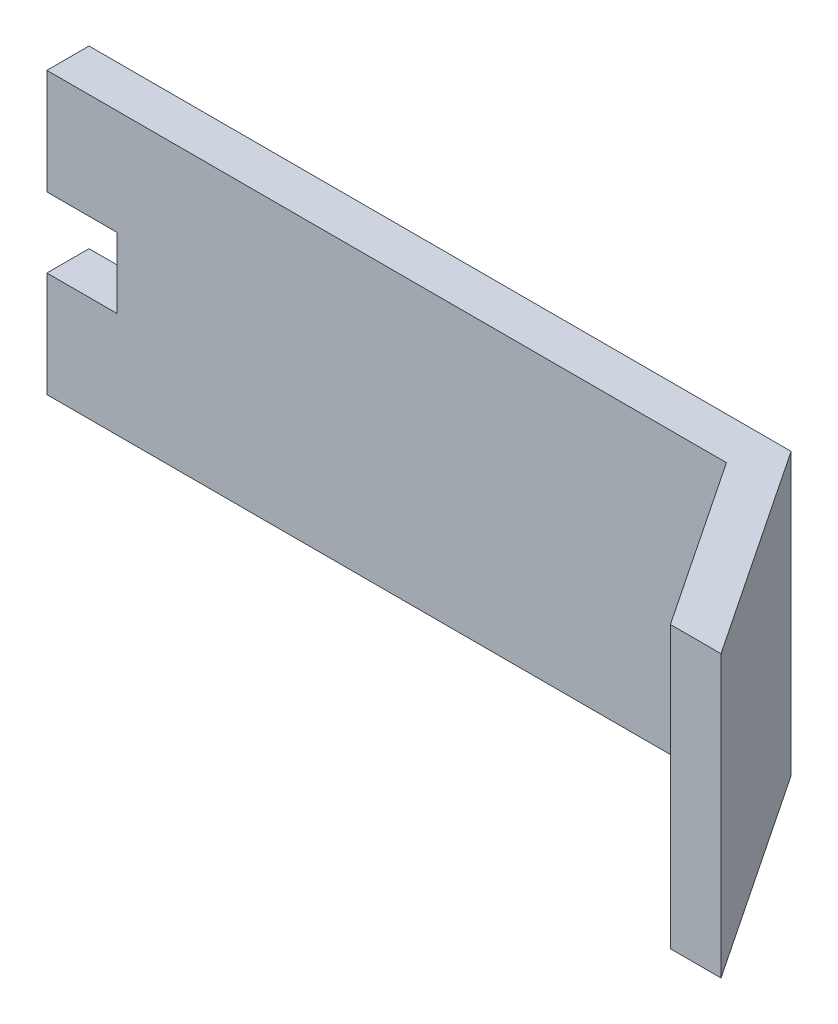
ISO-10303-21;
HEADER;
FILE_DESCRIPTION(('STEP AP214'),'2;1');
FILE_NAME('part.step','',(''),(''),'','','');
FILE_SCHEMA(('AUTOMOTIVE_DESIGN { 1 0 10303 214 1 1 1 1 }'));
ENDSEC;
DATA;
#1=APPLICATION_CONTEXT('core data for automotive mechanical design processes');
#2=APPLICATION_PROTOCOL_DEFINITION('international standard','automotive_design',2000,#1);
#3=PRODUCT_CONTEXT('',#1,'mechanical');
#4=PRODUCT('Part','Part','',(#3));
#5=PRODUCT_RELATED_PRODUCT_CATEGORY('part','',(#4));
#6=PRODUCT_DEFINITION_FORMATION('','',#4);
#7=PRODUCT_DEFINITION_CONTEXT('part definition',#1,'design');
#8=PRODUCT_DEFINITION('design','',#6,#7);
#9=PRODUCT_DEFINITION_SHAPE('','',#8);
#10=(LENGTH_UNIT() NAMED_UNIT(*) SI_UNIT(.MILLI.,.METRE.));
#11=(NAMED_UNIT(*) PLANE_ANGLE_UNIT() SI_UNIT($,.RADIAN.));
#12=(NAMED_UNIT(*) SI_UNIT($,.STERADIAN.) SOLID_ANGLE_UNIT());
#13=UNCERTAINTY_MEASURE_WITH_UNIT(LENGTH_MEASURE(1.E-05),#10,'distance_accuracy_value','');
#14=(GEOMETRIC_REPRESENTATION_CONTEXT(3) GLOBAL_UNCERTAINTY_ASSIGNED_CONTEXT((#13)) GLOBAL_UNIT_ASSIGNED_CONTEXT((#10,
#11,#12)) REPRESENTATION_CONTEXT('',''));
#15=CARTESIAN_POINT('',(0.,0.,0.));
#16=DIRECTION('',(0.,0.,1.));
#17=DIRECTION('',(1.,0.,0.));
#18=AXIS2_PLACEMENT_3D('',#15,#16,#17);
#19=CARTESIAN_POINT('',(0.,20.,0.));
#20=DIRECTION('',(1.,0.,0.));
#21=DIRECTION('',(0.,0.,-1.));
#22=AXIS2_PLACEMENT_3D('',#19,#20,#21);
#23=PLANE('',#22);
#24=DIRECTION('',(0.,-1.,0.));
#25=VECTOR('',#24,1.);
#26=CARTESIAN_POINT('',(0.,20.,0.));
#27=LINE('',#26,#25);
#28=CARTESIAN_POINT('',(0.,7.5,0.));
#29=VERTEX_POINT('',#28);
#30=CARTESIAN_POINT('',(0.,0.,0.));
#31=VERTEX_POINT('',#30);
#32=EDGE_CURVE('E95',#29,#31,#27,.T.);
#33=ORIENTED_EDGE('',*,*,#32,.F.);
#34=DIRECTION('',(0.,0.,-1.));
#35=VECTOR('',#34,1.);
#36=CARTESIAN_POINT('',(0.,7.5,0.));
#37=LINE('',#36,#35);
#38=CARTESIAN_POINT('',(0.,7.5,-3.));
#39=VERTEX_POINT('',#38);
#40=EDGE_CURVE('E11',#29,#39,#37,.T.);
#41=ORIENTED_EDGE('',*,*,#40,.T.);
#42=DIRECTION('',(0.,-1.,0.));
#43=VECTOR('',#42,1.);
#44=CARTESIAN_POINT('',(0.,20.,-3.));
#45=LINE('',#44,#43);
#46=CARTESIAN_POINT('',(0.,0.,-3.));
#47=VERTEX_POINT('',#46);
#48=EDGE_CURVE('E171',#39,#47,#45,.T.);
#49=ORIENTED_EDGE('',*,*,#48,.T.);
#50=DIRECTION('',(0.,0.,1.));
#51=VECTOR('',#50,1.);
#52=CARTESIAN_POINT('',(0.,0.,0.));
#53=LINE('',#52,#51);
#54=EDGE_CURVE('E163',#47,#31,#53,.T.);
#55=ORIENTED_EDGE('',*,*,#54,.T.);
#56=EDGE_LOOP('',(#33,#41,#49,#55));
#57=FACE_BOUND('',#56,.T.);
#58=ADVANCED_FACE('F42',(#57),#23,.F.);
#59=CARTESIAN_POINT('',(0.,20.,0.));
#60=DIRECTION('',(0.,0.,-1.));
#61=DIRECTION('',(-1.,0.,0.));
#62=AXIS2_PLACEMENT_3D('',#59,#60,#61);
#63=PLANE('',#62);
#64=DIRECTION('',(0.,-1.,0.));
#65=VECTOR('',#64,1.);
#66=CARTESIAN_POINT('',(5.,20.,0.));
#67=LINE('',#66,#65);
#68=CARTESIAN_POINT('',(5.,12.5,0.));
#69=VERTEX_POINT('',#68);
#70=CARTESIAN_POINT('',(5.,7.5,0.));
#71=VERTEX_POINT('',#70);
#72=EDGE_CURVE('E152',#69,#71,#67,.T.);
#73=ORIENTED_EDGE('',*,*,#72,.T.);
#74=DIRECTION('',(-1.,0.,0.));
#75=VECTOR('',#74,1.);
#76=CARTESIAN_POINT('',(0.,7.5,0.));
#77=LINE('',#76,#75);
#78=EDGE_CURVE('E199',#71,#29,#77,.T.);
#79=ORIENTED_EDGE('',*,*,#78,.T.);
#80=ORIENTED_EDGE('',*,*,#32,.T.);
#81=DIRECTION('',(1.,0.,0.));
#82=VECTOR('',#81,1.);
#83=CARTESIAN_POINT('',(0.,0.,0.));
#84=LINE('',#83,#82);
#85=CARTESIAN_POINT('',(48.3944464503656,0.,0.));
#86=VERTEX_POINT('',#85);
#87=EDGE_CURVE('E148',#31,#86,#84,.T.);
#88=ORIENTED_EDGE('',*,*,#87,.T.);
#89=DIRECTION('',(0.,-1.,0.));
#90=VECTOR('',#89,1.);
#91=CARTESIAN_POINT('',(48.3944464503656,20.,0.));
#92=LINE('',#91,#90);
#93=CARTESIAN_POINT('',(48.3944464503656,20.,0.));
#94=VERTEX_POINT('',#93);
#95=EDGE_CURVE('E180',#94,#86,#92,.T.);
#96=ORIENTED_EDGE('',*,*,#95,.F.);
#97=DIRECTION('',(1.,0.,0.));
#98=VECTOR('',#97,1.);
#99=CARTESIAN_POINT('',(0.,20.,0.));
#100=LINE('',#99,#98);
#101=CARTESIAN_POINT('',(0.,20.,0.));
#102=VERTEX_POINT('',#101);
#103=EDGE_CURVE('E166',#102,#94,#100,.T.);
#104=ORIENTED_EDGE('',*,*,#103,.F.);
#105=CARTESIAN_POINT('',(0.,12.5,0.));
#106=VERTEX_POINT('',#105);
#107=EDGE_CURVE('E167',#102,#106,#27,.T.);
#108=ORIENTED_EDGE('',*,*,#107,.T.);
#109=DIRECTION('',(1.,0.,0.));
#110=VECTOR('',#109,1.);
#111=CARTESIAN_POINT('',(0.,12.5,0.));
#112=LINE('',#111,#110);
#113=EDGE_CURVE('E58',#106,#69,#112,.T.);
#114=ORIENTED_EDGE('',*,*,#113,.T.);
#115=EDGE_LOOP('',(#73,#79,#80,#88,#96,#104,#108,#114));
#116=FACE_BOUND('',#115,.T.);
#117=ADVANCED_FACE('F44',(#116),#63,.F.);
#118=CARTESIAN_POINT('',(48.3944464503656,20.,0.));
#119=DIRECTION('',(0.832050948079559,0.,-0.554699215611404));
#120=DIRECTION('',(-0.554699215611404,0.,-0.832050948079559));
#121=AXIS2_PLACEMENT_3D('',#118,#119,#120);
#122=PLANE('',#121);
#123=DIRECTION('',(0.554699215611404,0.,0.832050948079559));
#124=VECTOR('',#123,1.);
#125=CARTESIAN_POINT('',(48.3944464503656,0.,0.));
#126=LINE('',#125,#124);
#127=CARTESIAN_POINT('',(56.3790374384198,0.,11.9769170654321));
#128=VERTEX_POINT('',#127);
#129=EDGE_CURVE('E151',#86,#128,#126,.T.);
#130=ORIENTED_EDGE('',*,*,#129,.T.);
#131=DIRECTION('',(0.,-1.,0.));
#132=VECTOR('',#131,1.);
#133=CARTESIAN_POINT('',(56.3790374384198,20.,11.9769170654321));
#134=LINE('',#133,#132);
#135=CARTESIAN_POINT('',(56.3790374384198,20.,11.9769170654321));
#136=VERTEX_POINT('',#135);
#137=EDGE_CURVE('E176',#136,#128,#134,.T.);
#138=ORIENTED_EDGE('',*,*,#137,.F.);
#139=DIRECTION('',(0.554699215611404,0.,0.832050948079559));
#140=VECTOR('',#139,1.);
#141=CARTESIAN_POINT('',(48.3944464503656,20.,0.));
#142=LINE('',#141,#140);
#143=EDGE_CURVE('E104',#94,#136,#142,.T.);
#144=ORIENTED_EDGE('',*,*,#143,.F.);
#145=ORIENTED_EDGE('',*,*,#95,.T.);
#146=EDGE_LOOP('',(#130,#138,#144,#145));
#147=FACE_BOUND('',#146,.T.);
#148=ADVANCED_FACE('F250',(#147),#122,.F.);
#149=CARTESIAN_POINT('',(56.3790374384198,20.,11.9769170654321));
#150=DIRECTION('',(0.,0.,-1.));
#151=DIRECTION('',(-1.,0.,0.));
#152=AXIS2_PLACEMENT_3D('',#149,#150,#151);
#153=PLANE('',#152);
#154=DIRECTION('',(1.,0.,0.));
#155=VECTOR('',#154,1.);
#156=CARTESIAN_POINT('',(56.3790374384198,0.,11.9769170654321));
#157=LINE('',#156,#155);
#158=CARTESIAN_POINT('',(59.9845858810053,0.,11.9769170654321));
#159=VERTEX_POINT('',#158);
#160=EDGE_CURVE('E155',#128,#159,#157,.T.);
#161=ORIENTED_EDGE('',*,*,#160,.T.);
#162=DIRECTION('',(0.,-1.,0.));
#163=VECTOR('',#162,1.);
#164=CARTESIAN_POINT('',(59.9845858810053,20.,11.9769170654321));
#165=LINE('',#164,#163);
#166=CARTESIAN_POINT('',(59.9845858810053,20.,11.9769170654321));
#167=VERTEX_POINT('',#166);
#168=EDGE_CURVE('E135',#167,#159,#165,.T.);
#169=ORIENTED_EDGE('',*,*,#168,.F.);
#170=DIRECTION('',(1.,0.,0.));
#171=VECTOR('',#170,1.);
#172=CARTESIAN_POINT('',(56.3790374384198,20.,11.9769170654321));
#173=LINE('',#172,#171);
#174=EDGE_CURVE('E120',#136,#167,#173,.T.);
#175=ORIENTED_EDGE('',*,*,#174,.F.);
#176=ORIENTED_EDGE('',*,*,#137,.T.);
#177=EDGE_LOOP('',(#161,#169,#175,#176));
#178=FACE_BOUND('',#177,.T.);
#179=ADVANCED_FACE('F252',(#178),#153,.F.);
#180=CARTESIAN_POINT('',(50.,20.,-3.));
#181=DIRECTION('',(-0.832050948079559,0.,0.554699215611404));
#182=DIRECTION('',(0.554699215611404,0.,0.832050948079559));
#183=AXIS2_PLACEMENT_3D('',#180,#181,#182);
#184=PLANE('',#183);
#185=DIRECTION('',(-0.554699215611404,0.,-0.832050948079559));
#186=VECTOR('',#185,1.);
#187=CARTESIAN_POINT('',(50.,0.,-3.));
#188=LINE('',#187,#186);
#189=CARTESIAN_POINT('',(50.,0.,-3.));
#190=VERTEX_POINT('',#189);
#191=EDGE_CURVE('E130',#159,#190,#188,.T.);
#192=ORIENTED_EDGE('',*,*,#191,.T.);
#193=DIRECTION('',(0.,-1.,0.));
#194=VECTOR('',#193,1.);
#195=CARTESIAN_POINT('',(50.,20.,-3.));
#196=LINE('',#195,#194);
#197=CARTESIAN_POINT('',(50.,20.,-3.));
#198=VERTEX_POINT('',#197);
#199=EDGE_CURVE('E127',#198,#190,#196,.T.);
#200=ORIENTED_EDGE('',*,*,#199,.F.);
#201=DIRECTION('',(-0.554699215611404,0.,-0.832050948079559));
#202=VECTOR('',#201,1.);
#203=CARTESIAN_POINT('',(50.,20.,-3.));
#204=LINE('',#203,#202);
#205=EDGE_CURVE('E113',#167,#198,#204,.T.);
#206=ORIENTED_EDGE('',*,*,#205,.F.);
#207=ORIENTED_EDGE('',*,*,#168,.T.);
#208=EDGE_LOOP('',(#192,#200,#206,#207));
#209=FACE_BOUND('',#208,.T.);
#210=ADVANCED_FACE('F128',(#209),#184,.F.);
#211=CARTESIAN_POINT('',(0.,20.,-3.));
#212=DIRECTION('',(0.,0.,1.));
#213=DIRECTION('',(1.,0.,0.));
#214=AXIS2_PLACEMENT_3D('',#211,#212,#213);
#215=PLANE('',#214);
#216=ORIENTED_EDGE('',*,*,#48,.F.);
#217=DIRECTION('',(-1.,0.,0.));
#218=VECTOR('',#217,1.);
#219=CARTESIAN_POINT('',(5.,7.5,-3.));
#220=LINE('',#219,#218);
#221=CARTESIAN_POINT('',(5.,7.5,-3.));
#222=VERTEX_POINT('',#221);
#223=EDGE_CURVE('E209',#222,#39,#220,.T.);
#224=ORIENTED_EDGE('',*,*,#223,.F.);
#225=DIRECTION('',(0.,-1.,0.));
#226=VECTOR('',#225,1.);
#227=CARTESIAN_POINT('',(5.,12.5,-3.));
#228=LINE('',#227,#226);
#229=CARTESIAN_POINT('',(5.,12.5,-3.));
#230=VERTEX_POINT('',#229);
#231=EDGE_CURVE('E216',#230,#222,#228,.T.);
#232=ORIENTED_EDGE('',*,*,#231,.F.);
#233=DIRECTION('',(1.,0.,0.));
#234=VECTOR('',#233,1.);
#235=CARTESIAN_POINT('',(0.,12.5,-3.));
#236=LINE('',#235,#234);
#237=CARTESIAN_POINT('',(0.,12.5,-3.));
#238=VERTEX_POINT('',#237);
#239=EDGE_CURVE('E220',#238,#230,#236,.T.);
#240=ORIENTED_EDGE('',*,*,#239,.F.);
#241=CARTESIAN_POINT('',(0.,20.,-3.));
#242=VERTEX_POINT('',#241);
#243=EDGE_CURVE('E136',#242,#238,#45,.T.);
#244=ORIENTED_EDGE('',*,*,#243,.F.);
#245=DIRECTION('',(-1.,0.,0.));
#246=VECTOR('',#245,1.);
#247=CARTESIAN_POINT('',(0.,20.,-3.));
#248=LINE('',#247,#246);
#249=EDGE_CURVE('E117',#198,#242,#248,.T.);
#250=ORIENTED_EDGE('',*,*,#249,.F.);
#251=ORIENTED_EDGE('',*,*,#199,.T.);
#252=DIRECTION('',(-1.,0.,0.));
#253=VECTOR('',#252,1.);
#254=CARTESIAN_POINT('',(0.,0.,-3.));
#255=LINE('',#254,#253);
#256=EDGE_CURVE('E160',#190,#47,#255,.T.);
#257=ORIENTED_EDGE('',*,*,#256,.T.);
#258=EDGE_LOOP('',(#216,#224,#232,#240,#244,#250,#251,#257));
#259=FACE_BOUND('',#258,.T.);
#260=ADVANCED_FACE('F139',(#259),#215,.F.);
#261=ORIENTED_EDGE('',*,*,#243,.T.);
#262=DIRECTION('',(0.,0.,1.));
#263=VECTOR('',#262,1.);
#264=CARTESIAN_POINT('',(0.,12.5,0.));
#265=LINE('',#264,#263);
#266=EDGE_CURVE('E51',#238,#106,#265,.T.);
#267=ORIENTED_EDGE('',*,*,#266,.T.);
#268=ORIENTED_EDGE('',*,*,#107,.F.);
#269=DIRECTION('',(0.,0.,1.));
#270=VECTOR('',#269,1.);
#271=CARTESIAN_POINT('',(0.,20.,0.));
#272=LINE('',#271,#270);
#273=EDGE_CURVE('E67',#242,#102,#272,.T.);
#274=ORIENTED_EDGE('',*,*,#273,.F.);
#275=EDGE_LOOP('',(#261,#267,#268,#274));
#276=FACE_BOUND('',#275,.T.);
#277=ADVANCED_FACE('F184',(#276),#23,.F.);
#278=CARTESIAN_POINT('',(0.,20.,0.));
#279=DIRECTION('',(0.,1.,0.));
#280=DIRECTION('',(0.,0.,1.));
#281=AXIS2_PLACEMENT_3D('',#278,#279,#280);
#282=PLANE('',#281);
#283=ORIENTED_EDGE('',*,*,#103,.T.);
#284=ORIENTED_EDGE('',*,*,#143,.T.);
#285=ORIENTED_EDGE('',*,*,#174,.T.);
#286=ORIENTED_EDGE('',*,*,#205,.T.);
#287=ORIENTED_EDGE('',*,*,#249,.T.);
#288=ORIENTED_EDGE('',*,*,#273,.T.);
#289=EDGE_LOOP('',(#283,#284,#285,#286,#287,#288));
#290=FACE_BOUND('',#289,.T.);
#291=ADVANCED_FACE('F115',(#290),#282,.T.);
#292=CARTESIAN_POINT('',(0.,0.,0.));
#293=DIRECTION('',(0.,1.,0.));
#294=DIRECTION('',(0.,0.,1.));
#295=AXIS2_PLACEMENT_3D('',#292,#293,#294);
#296=PLANE('',#295);
#297=ORIENTED_EDGE('',*,*,#87,.F.);
#298=ORIENTED_EDGE('',*,*,#54,.F.);
#299=ORIENTED_EDGE('',*,*,#256,.F.);
#300=ORIENTED_EDGE('',*,*,#191,.F.);
#301=ORIENTED_EDGE('',*,*,#160,.F.);
#302=ORIENTED_EDGE('',*,*,#129,.F.);
#303=EDGE_LOOP('',(#297,#298,#299,#300,#301,#302));
#304=FACE_BOUND('',#303,.T.);
#305=ADVANCED_FACE('F248',(#304),#296,.F.);
#306=CARTESIAN_POINT('',(5.,12.5,7.));
#307=DIRECTION('',(1.,0.,0.));
#308=DIRECTION('',(0.,0.,-1.));
#309=AXIS2_PLACEMENT_3D('',#306,#307,#308);
#310=PLANE('',#309);
#311=DIRECTION('',(0.,0.,-1.));
#312=VECTOR('',#311,1.);
#313=CARTESIAN_POINT('',(5.,12.5,7.));
#314=LINE('',#313,#312);
#315=EDGE_CURVE('E205',#69,#230,#314,.T.);
#316=ORIENTED_EDGE('',*,*,#315,.T.);
#317=ORIENTED_EDGE('',*,*,#231,.T.);
#318=DIRECTION('',(0.,0.,-1.));
#319=VECTOR('',#318,1.);
#320=CARTESIAN_POINT('',(5.,7.5,7.));
#321=LINE('',#320,#319);
#322=EDGE_CURVE('E204',#71,#222,#321,.T.);
#323=ORIENTED_EDGE('',*,*,#322,.F.);
#324=ORIENTED_EDGE('',*,*,#72,.F.);
#325=EDGE_LOOP('',(#316,#317,#323,#324));
#326=FACE_BOUND('',#325,.T.);
#327=ADVANCED_FACE('F230',(#326),#310,.F.);
#328=CARTESIAN_POINT('',(5.,7.5,7.));
#329=DIRECTION('',(0.,-1.,0.));
#330=DIRECTION('',(0.,0.,-1.));
#331=AXIS2_PLACEMENT_3D('',#328,#329,#330);
#332=PLANE('',#331);
#333=ORIENTED_EDGE('',*,*,#322,.T.);
#334=ORIENTED_EDGE('',*,*,#223,.T.);
#335=ORIENTED_EDGE('',*,*,#40,.F.);
#336=ORIENTED_EDGE('',*,*,#78,.F.);
#337=EDGE_LOOP('',(#333,#334,#335,#336));
#338=FACE_BOUND('',#337,.T.);
#339=ADVANCED_FACE('F241',(#338),#332,.F.);
#340=CARTESIAN_POINT('',(0.,12.5,7.));
#341=DIRECTION('',(0.,1.,0.));
#342=DIRECTION('',(0.,0.,1.));
#343=AXIS2_PLACEMENT_3D('',#340,#341,#342);
#344=PLANE('',#343);
#345=ORIENTED_EDGE('',*,*,#266,.F.);
#346=ORIENTED_EDGE('',*,*,#239,.T.);
#347=ORIENTED_EDGE('',*,*,#315,.F.);
#348=ORIENTED_EDGE('',*,*,#113,.F.);
#349=EDGE_LOOP('',(#345,#346,#347,#348));
#350=FACE_BOUND('',#349,.T.);
#351=ADVANCED_FACE('F224',(#350),#344,.F.);
#352=CLOSED_SHELL('',(#58,#117,#148,#179,#210,#260,#277,#291,#305,#327,#339,#351));
#353=MANIFOLD_SOLID_BREP('B2',#352);
#354=ADVANCED_BREP_SHAPE_REPRESENTATION('',(#18,#353),#14);
#355=SHAPE_DEFINITION_REPRESENTATION(#9,#354);
ENDSEC;
END-ISO-10303-21;
